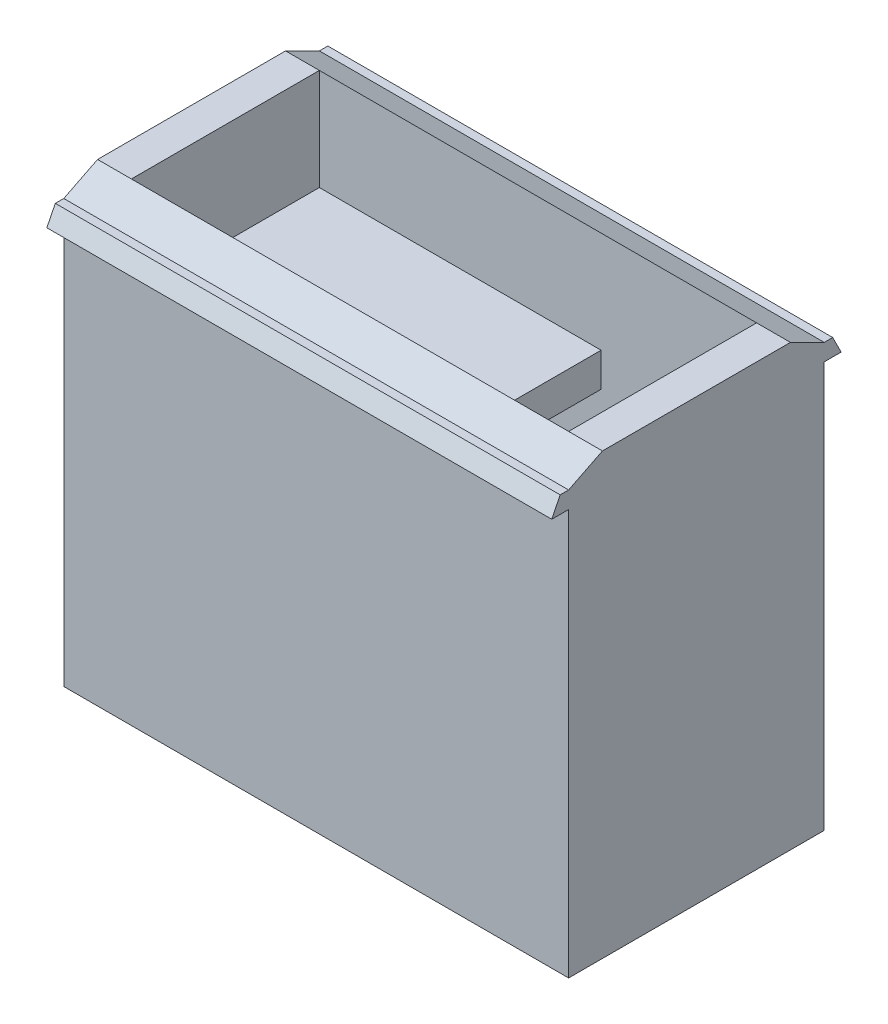
ISO-10303-21;
HEADER;
FILE_DESCRIPTION(('STEP AP214'),'2;1');
FILE_NAME('part.step','',(''),(''),'','','');
FILE_SCHEMA(('AUTOMOTIVE_DESIGN { 1 0 10303 214 1 1 1 1 }'));
ENDSEC;
DATA;
#1=APPLICATION_CONTEXT('core data for automotive mechanical design processes');
#2=APPLICATION_PROTOCOL_DEFINITION('international standard','automotive_design',2000,#1);
#3=PRODUCT_CONTEXT('',#1,'mechanical');
#4=PRODUCT('Part','Part','',(#3));
#5=PRODUCT_RELATED_PRODUCT_CATEGORY('part','',(#4));
#6=PRODUCT_DEFINITION_FORMATION('','',#4);
#7=PRODUCT_DEFINITION_CONTEXT('part definition',#1,'design');
#8=PRODUCT_DEFINITION('design','',#6,#7);
#9=PRODUCT_DEFINITION_SHAPE('','',#8);
#10=(LENGTH_UNIT() NAMED_UNIT(*) SI_UNIT(.MILLI.,.METRE.));
#11=(NAMED_UNIT(*) PLANE_ANGLE_UNIT() SI_UNIT($,.RADIAN.));
#12=(NAMED_UNIT(*) SI_UNIT($,.STERADIAN.) SOLID_ANGLE_UNIT());
#13=UNCERTAINTY_MEASURE_WITH_UNIT(LENGTH_MEASURE(1.E-05),#10,'distance_accuracy_value','');
#14=(GEOMETRIC_REPRESENTATION_CONTEXT(3) GLOBAL_UNCERTAINTY_ASSIGNED_CONTEXT((#13)) GLOBAL_UNIT_ASSIGNED_CONTEXT((#10,
#11,#12)) REPRESENTATION_CONTEXT('',''));
#15=CARTESIAN_POINT('',(0.,0.,0.));
#16=DIRECTION('',(0.,0.,1.));
#17=DIRECTION('',(1.,0.,0.));
#18=AXIS2_PLACEMENT_3D('',#15,#16,#17);
#19=CARTESIAN_POINT('',(1.,10.,0.));
#20=DIRECTION('',(1.,0.,0.));
#21=DIRECTION('',(0.,0.,-1.));
#22=AXIS2_PLACEMENT_3D('',#19,#20,#21);
#23=PLANE('',#22);
#24=DIRECTION('',(0.,0.447213595499959,-0.894427190999916));
#25=VECTOR('',#24,1.);
#26=CARTESIAN_POINT('',(1.,12.4,1.2));
#27=LINE('',#26,#25);
#28=CARTESIAN_POINT('',(1.,12.5,1.));
#29=VERTEX_POINT('',#28);
#30=CARTESIAN_POINT('',(1.,13.,0.));
#31=VERTEX_POINT('',#30);
#32=EDGE_CURVE('E369',#29,#31,#27,.T.);
#33=ORIENTED_EDGE('',*,*,#32,.F.);
#34=DIRECTION('',(0.,0.,1.));
#35=VECTOR('',#34,1.);
#36=CARTESIAN_POINT('',(1.,12.5,0.));
#37=LINE('',#36,#35);
#38=CARTESIAN_POINT('',(1.,12.5,1.25));
#39=VERTEX_POINT('',#38);
#40=EDGE_CURVE('E376',#29,#39,#37,.T.);
#41=ORIENTED_EDGE('',*,*,#40,.T.);
#42=DIRECTION('',(0.,0.894427190999916,-0.447213595499958));
#43=VECTOR('',#42,1.);
#44=CARTESIAN_POINT('',(1.,3.,6.));
#45=LINE('',#44,#43);
#46=CARTESIAN_POINT('',(1.,12.,1.5));
#47=VERTEX_POINT('',#46);
#48=EDGE_CURVE('E365',#47,#39,#45,.T.);
#49=ORIENTED_EDGE('',*,*,#48,.F.);
#50=DIRECTION('',(0.,0.,-1.));
#51=VECTOR('',#50,1.);
#52=CARTESIAN_POINT('',(1.,12.,2.));
#53=LINE('',#52,#51);
#54=CARTESIAN_POINT('',(1.,12.,1.));
#55=VERTEX_POINT('',#54);
#56=EDGE_CURVE('E337',#47,#55,#53,.T.);
#57=ORIENTED_EDGE('',*,*,#56,.T.);
#58=DIRECTION('',(0.,-1.,0.));
#59=VECTOR('',#58,1.);
#60=CARTESIAN_POINT('',(1.,10.,1.));
#61=LINE('',#60,#59);
#62=CARTESIAN_POINT('',(1.,0.,1.));
#63=VERTEX_POINT('',#62);
#64=EDGE_CURVE('E298',#55,#63,#61,.T.);
#65=ORIENTED_EDGE('',*,*,#64,.T.);
#66=DIRECTION('',(0.,0.,1.));
#67=VECTOR('',#66,1.);
#68=CARTESIAN_POINT('',(1.,0.,0.));
#69=LINE('',#68,#67);
#70=CARTESIAN_POINT('',(1.,0.,-6.56));
#71=VERTEX_POINT('',#70);
#72=EDGE_CURVE('E273',#71,#63,#69,.T.);
#73=ORIENTED_EDGE('',*,*,#72,.F.);
#74=DIRECTION('',(0.,-1.,0.));
#75=VECTOR('',#74,1.);
#76=CARTESIAN_POINT('',(1.,10.,-6.56));
#77=LINE('',#76,#75);
#78=CARTESIAN_POINT('',(1.,12.001317313685,-6.56));
#79=VERTEX_POINT('',#78);
#80=EDGE_CURVE('E306',#79,#71,#77,.T.);
#81=ORIENTED_EDGE('',*,*,#80,.F.);
#82=DIRECTION('',(0.,0.,1.));
#83=VECTOR('',#82,1.);
#84=CARTESIAN_POINT('',(1.,12.001317313685,-7.56));
#85=LINE('',#84,#83);
#86=CARTESIAN_POINT('',(1.,12.001317313685,-7.06));
#87=VERTEX_POINT('',#86);
#88=EDGE_CURVE('E333',#87,#79,#85,.T.);
#89=ORIENTED_EDGE('',*,*,#88,.F.);
#90=DIRECTION('',(0.,0.894191169765689,0.447685326890516));
#91=VECTOR('',#90,1.);
#92=CARTESIAN_POINT('',(1.,5.23156268074281,-10.4493421432594));
#93=LINE('',#92,#91);
#94=CARTESIAN_POINT('',(1.,12.5006586568425,-6.81));
#95=VERTEX_POINT('',#94);
#96=EDGE_CURVE('E366',#87,#95,#93,.T.);
#97=ORIENTED_EDGE('',*,*,#96,.T.);
#98=DIRECTION('',(0.,0.,-1.));
#99=VECTOR('',#98,1.);
#100=CARTESIAN_POINT('',(1.,12.5006586568425,0.));
#101=LINE('',#100,#99);
#102=CARTESIAN_POINT('',(1.,12.5006586568425,-6.56));
#103=VERTEX_POINT('',#102);
#104=EDGE_CURVE('E82',#103,#95,#101,.T.);
#105=ORIENTED_EDGE('',*,*,#104,.F.);
#106=DIRECTION('',(0.,-0.446742112774849,-0.894662777069362));
#107=VECTOR('',#106,1.);
#108=CARTESIAN_POINT('',(1.,14.6235049322447,-2.30870716296248));
#109=LINE('',#108,#107);
#110=CARTESIAN_POINT('',(1.,13.,-5.55999999999999));
#111=VERTEX_POINT('',#110);
#112=EDGE_CURVE('E374',#111,#103,#109,.T.);
#113=ORIENTED_EDGE('',*,*,#112,.F.);
#114=DIRECTION('',(0.,0.,-1.));
#115=VECTOR('',#114,1.);
#116=CARTESIAN_POINT('',(1.,13.,0.));
#117=LINE('',#116,#115);
#118=EDGE_CURVE('E221',#31,#111,#117,.T.);
#119=ORIENTED_EDGE('',*,*,#118,.F.);
#120=EDGE_LOOP('',(#33,#41,#49,#57,#65,#73,#81,#89,#97,#105,#113,#119));
#121=FACE_BOUND('',#120,.T.);
#122=ADVANCED_FACE('F60',(#121),#23,.T.);
#123=CARTESIAN_POINT('',(-13.9319558976376,10.,0.));
#124=DIRECTION('',(1.,0.,0.));
#125=DIRECTION('',(0.,0.,-1.));
#126=AXIS2_PLACEMENT_3D('',#123,#124,#125);
#127=PLANE('',#126);
#128=DIRECTION('',(0.,0.,-1.));
#129=VECTOR('',#128,1.);
#130=CARTESIAN_POINT('',(-13.9319558976376,12.5,0.));
#131=LINE('',#130,#129);
#132=CARTESIAN_POINT('',(-13.9319558976376,12.5,1.25));
#133=VERTEX_POINT('',#132);
#134=CARTESIAN_POINT('',(-13.9319558976376,12.5,1.));
#135=VERTEX_POINT('',#134);
#136=EDGE_CURVE('E74',#133,#135,#131,.T.);
#137=ORIENTED_EDGE('',*,*,#136,.T.);
#138=DIRECTION('',(0.,-0.447213595499959,0.894427190999916));
#139=VECTOR('',#138,1.);
#140=CARTESIAN_POINT('',(-13.9319558976376,10.4,5.20000000000001));
#141=LINE('',#140,#139);
#142=CARTESIAN_POINT('',(-13.9319558976376,13.,0.));
#143=VERTEX_POINT('',#142);
#144=EDGE_CURVE('E201',#143,#135,#141,.T.);
#145=ORIENTED_EDGE('',*,*,#144,.F.);
#146=DIRECTION('',(0.,0.,1.));
#147=VECTOR('',#146,1.);
#148=CARTESIAN_POINT('',(-13.9319558976376,13.,0.));
#149=LINE('',#148,#147);
#150=CARTESIAN_POINT('',(-13.9319558976376,13.,-5.55999999999999));
#151=VERTEX_POINT('',#150);
#152=EDGE_CURVE('E214',#151,#143,#149,.T.);
#153=ORIENTED_EDGE('',*,*,#152,.F.);
#154=DIRECTION('',(0.,0.446742112774849,0.894662777069363));
#155=VECTOR('',#154,1.);
#156=CARTESIAN_POINT('',(-13.9319558976376,12.6277197789794,-6.30554255545229));
#157=LINE('',#156,#155);
#158=CARTESIAN_POINT('',(-13.9319558976376,12.5006586568425,-6.56));
#159=VERTEX_POINT('',#158);
#160=EDGE_CURVE('E317',#159,#151,#157,.T.);
#161=ORIENTED_EDGE('',*,*,#160,.F.);
#162=DIRECTION('',(0.,0.,1.));
#163=VECTOR('',#162,1.);
#164=CARTESIAN_POINT('',(-13.9319558976376,12.5006586568425,-6.81));
#165=LINE('',#164,#163);
#166=CARTESIAN_POINT('',(-13.9319558976376,12.5006586568425,-6.81));
#167=VERTEX_POINT('',#166);
#168=EDGE_CURVE('E216',#167,#159,#165,.T.);
#169=ORIENTED_EDGE('',*,*,#168,.F.);
#170=DIRECTION('',(0.,0.894191169765689,0.447685326890516));
#171=VECTOR('',#170,1.);
#172=CARTESIAN_POINT('',(-13.9319558976376,13.2273411616121,-6.44617948186777));
#173=LINE('',#172,#171);
#174=CARTESIAN_POINT('',(-13.9319558976376,12.001317313685,-7.06));
#175=VERTEX_POINT('',#174);
#176=EDGE_CURVE('E315',#175,#167,#173,.T.);
#177=ORIENTED_EDGE('',*,*,#176,.F.);
#178=DIRECTION('',(0.,0.,1.));
#179=VECTOR('',#178,1.);
#180=CARTESIAN_POINT('',(-13.9319558976376,12.001317313685,-7.56));
#181=LINE('',#180,#179);
#182=CARTESIAN_POINT('',(-13.9319558976376,12.001317313685,-6.56));
#183=VERTEX_POINT('',#182);
#184=EDGE_CURVE('E326',#175,#183,#181,.T.);
#185=ORIENTED_EDGE('',*,*,#184,.T.);
#186=DIRECTION('',(0.,-1.,0.));
#187=VECTOR('',#186,1.);
#188=CARTESIAN_POINT('',(-13.9319558976376,10.,-6.56));
#189=LINE('',#188,#187);
#190=CARTESIAN_POINT('',(-13.9319558976376,0.,-6.56));
#191=VERTEX_POINT('',#190);
#192=EDGE_CURVE('E304',#183,#191,#189,.T.);
#193=ORIENTED_EDGE('',*,*,#192,.T.);
#194=DIRECTION('',(0.,0.,1.));
#195=VECTOR('',#194,1.);
#196=CARTESIAN_POINT('',(-13.9319558976376,0.,0.));
#197=LINE('',#196,#195);
#198=CARTESIAN_POINT('',(-13.9319558976376,0.,1.));
#199=VERTEX_POINT('',#198);
#200=EDGE_CURVE('E279',#191,#199,#197,.T.);
#201=ORIENTED_EDGE('',*,*,#200,.T.);
#202=DIRECTION('',(0.,-1.,0.));
#203=VECTOR('',#202,1.);
#204=CARTESIAN_POINT('',(-13.9319558976376,10.,1.));
#205=LINE('',#204,#203);
#206=CARTESIAN_POINT('',(-13.9319558976376,12.,1.));
#207=VERTEX_POINT('',#206);
#208=EDGE_CURVE('E294',#207,#199,#205,.T.);
#209=ORIENTED_EDGE('',*,*,#208,.F.);
#210=DIRECTION('',(0.,0.,-1.));
#211=VECTOR('',#210,1.);
#212=CARTESIAN_POINT('',(-13.9319558976376,12.,2.));
#213=LINE('',#212,#211);
#214=CARTESIAN_POINT('',(-13.9319558976376,12.,1.5));
#215=VERTEX_POINT('',#214);
#216=EDGE_CURVE('E227',#215,#207,#213,.T.);
#217=ORIENTED_EDGE('',*,*,#216,.F.);
#218=DIRECTION('',(0.,0.894427190999916,-0.447213595499958));
#219=VECTOR('',#218,1.);
#220=CARTESIAN_POINT('',(-13.9319558976376,11.,2.));
#221=LINE('',#220,#219);
#222=EDGE_CURVE('E323',#215,#133,#221,.T.);
#223=ORIENTED_EDGE('',*,*,#222,.T.);
#224=EDGE_LOOP('',(#137,#145,#153,#161,#169,#177,#185,#193,#201,#209,#217,#223));
#225=FACE_BOUND('',#224,.T.);
#226=ADVANCED_FACE('F212',(#225),#127,.F.);
#227=CARTESIAN_POINT('',(0.,13.,0.));
#228=DIRECTION('',(0.,1.,0.));
#229=DIRECTION('',(0.,0.,1.));
#230=AXIS2_PLACEMENT_3D('',#227,#228,#229);
#231=PLANE('',#230);
#232=DIRECTION('',(-1.,0.,0.));
#233=VECTOR('',#232,1.);
#234=CARTESIAN_POINT('',(1.06804410236237,13.,0.));
#235=LINE('',#234,#233);
#236=CARTESIAN_POINT('',(0.,13.,0.));
#237=VERTEX_POINT('',#236);
#238=EDGE_CURVE('E208',#31,#237,#235,.T.);
#239=ORIENTED_EDGE('',*,*,#238,.F.);
#240=ORIENTED_EDGE('',*,*,#118,.T.);
#241=DIRECTION('',(-1.,0.,0.));
#242=VECTOR('',#241,1.);
#243=CARTESIAN_POINT('',(1.06804410236237,13.,-5.55999999999999));
#244=LINE('',#243,#242);
#245=CARTESIAN_POINT('',(0.,13.,-5.55999999999999));
#246=VERTEX_POINT('',#245);
#247=EDGE_CURVE('E384',#111,#246,#244,.T.);
#248=ORIENTED_EDGE('',*,*,#247,.T.);
#249=DIRECTION('',(0.,0.,1.));
#250=VECTOR('',#249,1.);
#251=CARTESIAN_POINT('',(0.,13.,0.));
#252=LINE('',#251,#250);
#253=EDGE_CURVE('E234',#246,#237,#252,.T.);
#254=ORIENTED_EDGE('',*,*,#253,.T.);
#255=EDGE_LOOP('',(#239,#240,#248,#254));
#256=FACE_BOUND('',#255,.T.);
#257=ADVANCED_FACE('F399',(#256),#231,.T.);
#258=CARTESIAN_POINT('',(-14.,3.,6.));
#259=DIRECTION('',(0.,-0.447213595499958,-0.894427190999916));
#260=DIRECTION('',(0.,0.894427190999916,-0.447213595499958));
#261=AXIS2_PLACEMENT_3D('',#258,#259,#260);
#262=PLANE('',#261);
#263=DIRECTION('',(1.,0.,0.));
#264=VECTOR('',#263,1.);
#265=CARTESIAN_POINT('',(-14.,12.5,1.25));
#266=LINE('',#265,#264);
#267=EDGE_CURVE('E12',#133,#39,#266,.T.);
#268=ORIENTED_EDGE('',*,*,#267,.F.);
#269=ORIENTED_EDGE('',*,*,#222,.F.);
#270=DIRECTION('',(1.,0.,0.));
#271=VECTOR('',#270,1.);
#272=CARTESIAN_POINT('',(-14.,12.,1.5));
#273=LINE('',#272,#271);
#274=EDGE_CURVE('E328',#215,#47,#273,.T.);
#275=ORIENTED_EDGE('',*,*,#274,.T.);
#276=ORIENTED_EDGE('',*,*,#48,.T.);
#277=EDGE_LOOP('',(#268,#269,#275,#276));
#278=FACE_BOUND('',#277,.T.);
#279=ADVANCED_FACE('F467',(#278),#262,.F.);
#280=CARTESIAN_POINT('',(1.,12.001317313685,-7.56));
#281=DIRECTION('',(0.,1.,0.));
#282=DIRECTION('',(0.,0.,1.));
#283=AXIS2_PLACEMENT_3D('',#280,#281,#282);
#284=PLANE('',#283);
#285=DIRECTION('',(1.,0.,0.));
#286=VECTOR('',#285,1.);
#287=CARTESIAN_POINT('',(-14.,12.001317313685,-7.06));
#288=LINE('',#287,#286);
#289=EDGE_CURVE('E321',#175,#87,#288,.T.);
#290=ORIENTED_EDGE('',*,*,#289,.T.);
#291=ORIENTED_EDGE('',*,*,#88,.T.);
#292=DIRECTION('',(-1.,0.,0.));
#293=VECTOR('',#292,1.);
#294=CARTESIAN_POINT('',(1.,12.001317313685,-6.56));
#295=LINE('',#294,#293);
#296=EDGE_CURVE('E322',#79,#183,#295,.T.);
#297=ORIENTED_EDGE('',*,*,#296,.T.);
#298=ORIENTED_EDGE('',*,*,#184,.F.);
#299=EDGE_LOOP('',(#290,#291,#297,#298));
#300=FACE_BOUND('',#299,.T.);
#301=ADVANCED_FACE('F364',(#300),#284,.F.);
#302=CARTESIAN_POINT('',(-12.9319558976376,13.,0.));
#303=VERTEX_POINT('',#302);
#304=EDGE_CURVE('E197',#303,#143,#235,.T.);
#305=ORIENTED_EDGE('',*,*,#304,.F.);
#306=DIRECTION('',(0.,0.,1.));
#307=VECTOR('',#306,1.);
#308=CARTESIAN_POINT('',(-12.9319558976376,13.,0.));
#309=LINE('',#308,#307);
#310=CARTESIAN_POINT('',(-12.9319558976376,13.,-5.55999999999999));
#311=VERTEX_POINT('',#310);
#312=EDGE_CURVE('E238',#311,#303,#309,.T.);
#313=ORIENTED_EDGE('',*,*,#312,.F.);
#314=EDGE_CURVE('E220',#311,#151,#244,.T.);
#315=ORIENTED_EDGE('',*,*,#314,.T.);
#316=ORIENTED_EDGE('',*,*,#152,.T.);
#317=EDGE_LOOP('',(#305,#313,#315,#316));
#318=FACE_BOUND('',#317,.T.);
#319=ADVANCED_FACE('F219',(#318),#231,.T.);
#320=CARTESIAN_POINT('',(0.,10.,-6.56));
#321=DIRECTION('',(0.,0.,1.));
#322=DIRECTION('',(1.,0.,0.));
#323=AXIS2_PLACEMENT_3D('',#320,#321,#322);
#324=PLANE('',#323);
#325=ORIENTED_EDGE('',*,*,#296,.F.);
#326=ORIENTED_EDGE('',*,*,#80,.T.);
#327=DIRECTION('',(-1.,0.,0.));
#328=VECTOR('',#327,1.);
#329=CARTESIAN_POINT('',(0.,0.,-6.56));
#330=LINE('',#329,#328);
#331=EDGE_CURVE('E276',#71,#191,#330,.T.);
#332=ORIENTED_EDGE('',*,*,#331,.T.);
#333=ORIENTED_EDGE('',*,*,#192,.F.);
#334=EDGE_LOOP('',(#325,#326,#332,#333));
#335=FACE_BOUND('',#334,.T.);
#336=ADVANCED_FACE('F362',(#335),#324,.F.);
#337=CARTESIAN_POINT('',(0.,10.,1.));
#338=DIRECTION('',(0.,0.,-1.));
#339=DIRECTION('',(-1.,0.,0.));
#340=AXIS2_PLACEMENT_3D('',#337,#338,#339);
#341=PLANE('',#340);
#342=DIRECTION('',(1.,0.,0.));
#343=VECTOR('',#342,1.);
#344=CARTESIAN_POINT('',(-13.9319558976376,12.,1.));
#345=LINE('',#344,#343);
#346=EDGE_CURVE('E335',#207,#55,#345,.T.);
#347=ORIENTED_EDGE('',*,*,#346,.F.);
#348=ORIENTED_EDGE('',*,*,#208,.T.);
#349=DIRECTION('',(1.,0.,0.));
#350=VECTOR('',#349,1.);
#351=CARTESIAN_POINT('',(0.,0.,1.));
#352=LINE('',#351,#350);
#353=EDGE_CURVE('E270',#199,#63,#352,.T.);
#354=ORIENTED_EDGE('',*,*,#353,.T.);
#355=ORIENTED_EDGE('',*,*,#64,.F.);
#356=EDGE_LOOP('',(#347,#348,#354,#355));
#357=FACE_BOUND('',#356,.T.);
#358=ADVANCED_FACE('F62',(#357),#341,.F.);
#359=CARTESIAN_POINT('',(0.,10.,0.));
#360=DIRECTION('',(0.,1.,0.));
#361=DIRECTION('',(0.,0.,1.));
#362=AXIS2_PLACEMENT_3D('',#359,#360,#361);
#363=PLANE('',#362);
#364=DIRECTION('',(0.,0.,1.));
#365=VECTOR('',#364,1.);
#366=CARTESIAN_POINT('',(-4.59948346161411,10.,0.));
#367=LINE('',#366,#365);
#368=CARTESIAN_POINT('',(-4.59948346161411,10.,-5.56));
#369=VERTEX_POINT('',#368);
#370=CARTESIAN_POINT('',(-4.59948346161411,10.,0.));
#371=VERTEX_POINT('',#370);
#372=EDGE_CURVE('E253',#369,#371,#367,.T.);
#373=ORIENTED_EDGE('',*,*,#372,.F.);
#374=DIRECTION('',(-1.,0.,0.));
#375=VECTOR('',#374,1.);
#376=CARTESIAN_POINT('',(0.,10.,-5.56));
#377=LINE('',#376,#375);
#378=CARTESIAN_POINT('',(-12.9319558976376,10.,-5.56));
#379=VERTEX_POINT('',#378);
#380=EDGE_CURVE('E242',#369,#379,#377,.T.);
#381=ORIENTED_EDGE('',*,*,#380,.T.);
#382=DIRECTION('',(0.,0.,1.));
#383=VECTOR('',#382,1.);
#384=CARTESIAN_POINT('',(-12.9319558976376,10.,0.));
#385=LINE('',#384,#383);
#386=CARTESIAN_POINT('',(-12.9319558976376,10.,0.));
#387=VERTEX_POINT('',#386);
#388=EDGE_CURVE('E222',#379,#387,#385,.T.);
#389=ORIENTED_EDGE('',*,*,#388,.T.);
#390=DIRECTION('',(-1.,0.,0.));
#391=VECTOR('',#390,1.);
#392=CARTESIAN_POINT('',(0.,10.,0.));
#393=LINE('',#392,#391);
#394=EDGE_CURVE('E244',#371,#387,#393,.T.);
#395=ORIENTED_EDGE('',*,*,#394,.F.);
#396=EDGE_LOOP('',(#373,#381,#389,#395));
#397=FACE_BOUND('',#396,.T.);
#398=ADVANCED_FACE('F426',(#397),#363,.T.);
#399=CARTESIAN_POINT('',(0.,10.,0.));
#400=DIRECTION('',(0.,0.,-1.));
#401=DIRECTION('',(-1.,0.,0.));
#402=AXIS2_PLACEMENT_3D('',#399,#400,#401);
#403=PLANE('',#402);
#404=DIRECTION('',(1.,0.,0.));
#405=VECTOR('',#404,1.);
#406=CARTESIAN_POINT('',(0.,9.,0.));
#407=LINE('',#406,#405);
#408=CARTESIAN_POINT('',(-13.,9.,0.));
#409=VERTEX_POINT('',#408);
#410=CARTESIAN_POINT('',(-4.59948346161411,9.,0.));
#411=VERTEX_POINT('',#410);
#412=EDGE_CURVE('E268',#409,#411,#407,.T.);
#413=ORIENTED_EDGE('',*,*,#412,.T.);
#414=DIRECTION('',(0.,1.,0.));
#415=VECTOR('',#414,1.);
#416=CARTESIAN_POINT('',(-4.59948346161411,10.,0.));
#417=LINE('',#416,#415);
#418=EDGE_CURVE('E261',#411,#371,#417,.T.);
#419=ORIENTED_EDGE('',*,*,#418,.T.);
#420=ORIENTED_EDGE('',*,*,#394,.T.);
#421=DIRECTION('',(0.,-1.,0.));
#422=VECTOR('',#421,1.);
#423=CARTESIAN_POINT('',(-12.9319558976376,13.,0.));
#424=LINE('',#423,#422);
#425=EDGE_CURVE('E250',#303,#387,#424,.T.);
#426=ORIENTED_EDGE('',*,*,#425,.F.);
#427=DIRECTION('',(-1.,0.,0.));
#428=VECTOR('',#427,1.);
#429=CARTESIAN_POINT('',(0.,13.,0.));
#430=LINE('',#429,#428);
#431=EDGE_CURVE('E203',#237,#303,#430,.T.);
#432=ORIENTED_EDGE('',*,*,#431,.F.);
#433=DIRECTION('',(0.,-1.,0.));
#434=VECTOR('',#433,1.);
#435=CARTESIAN_POINT('',(0.,10.,0.));
#436=LINE('',#435,#434);
#437=CARTESIAN_POINT('',(0.,0.,0.));
#438=VERTEX_POINT('',#437);
#439=EDGE_CURVE('E295',#237,#438,#436,.T.);
#440=ORIENTED_EDGE('',*,*,#439,.T.);
#441=DIRECTION('',(1.,0.,0.));
#442=VECTOR('',#441,1.);
#443=CARTESIAN_POINT('',(0.,0.,0.));
#444=LINE('',#443,#442);
#445=CARTESIAN_POINT('',(-13.,0.,0.));
#446=VERTEX_POINT('',#445);
#447=EDGE_CURVE('E282',#446,#438,#444,.T.);
#448=ORIENTED_EDGE('',*,*,#447,.F.);
#449=DIRECTION('',(0.,-1.,0.));
#450=VECTOR('',#449,1.);
#451=CARTESIAN_POINT('',(-13.,10.,0.));
#452=LINE('',#451,#450);
#453=EDGE_CURVE('E246',#409,#446,#452,.T.);
#454=ORIENTED_EDGE('',*,*,#453,.F.);
#455=EDGE_LOOP('',(#413,#419,#420,#426,#432,#440,#448,#454));
#456=FACE_BOUND('',#455,.T.);
#457=ADVANCED_FACE('F397',(#456),#403,.T.);
#458=CARTESIAN_POINT('',(-13.,10.,0.));
#459=DIRECTION('',(1.,0.,0.));
#460=DIRECTION('',(0.,0.,-1.));
#461=AXIS2_PLACEMENT_3D('',#458,#459,#460);
#462=PLANE('',#461);
#463=DIRECTION('',(0.,-1.,0.));
#464=VECTOR('',#463,1.);
#465=CARTESIAN_POINT('',(-13.,10.,-5.56));
#466=LINE('',#465,#464);
#467=CARTESIAN_POINT('',(-13.,9.,-5.56));
#468=VERTEX_POINT('',#467);
#469=CARTESIAN_POINT('',(-13.,0.,-5.56));
#470=VERTEX_POINT('',#469);
#471=EDGE_CURVE('E300',#468,#470,#466,.T.);
#472=ORIENTED_EDGE('',*,*,#471,.F.);
#473=DIRECTION('',(0.,0.,1.));
#474=VECTOR('',#473,1.);
#475=CARTESIAN_POINT('',(-13.,9.,0.));
#476=LINE('',#475,#474);
#477=EDGE_CURVE('E266',#468,#409,#476,.T.);
#478=ORIENTED_EDGE('',*,*,#477,.T.);
#479=ORIENTED_EDGE('',*,*,#453,.T.);
#480=DIRECTION('',(0.,0.,1.));
#481=VECTOR('',#480,1.);
#482=CARTESIAN_POINT('',(-13.,0.,0.));
#483=LINE('',#482,#481);
#484=EDGE_CURVE('E285',#470,#446,#483,.T.);
#485=ORIENTED_EDGE('',*,*,#484,.F.);
#486=EDGE_LOOP('',(#472,#478,#479,#485));
#487=FACE_BOUND('',#486,.T.);
#488=ADVANCED_FACE('F433',(#487),#462,.T.);
#489=CARTESIAN_POINT('',(0.,10.,-5.56));
#490=DIRECTION('',(0.,0.,1.));
#491=DIRECTION('',(1.,0.,0.));
#492=AXIS2_PLACEMENT_3D('',#489,#490,#491);
#493=PLANE('',#492);
#494=DIRECTION('',(0.,-1.,0.));
#495=VECTOR('',#494,1.);
#496=CARTESIAN_POINT('',(0.,10.,-5.56));
#497=LINE('',#496,#495);
#498=CARTESIAN_POINT('',(0.,0.,-5.56));
#499=VERTEX_POINT('',#498);
#500=EDGE_CURVE('E297',#246,#499,#497,.T.);
#501=ORIENTED_EDGE('',*,*,#500,.F.);
#502=DIRECTION('',(-1.,0.,0.));
#503=VECTOR('',#502,1.);
#504=CARTESIAN_POINT('',(0.,13.,-5.56));
#505=LINE('',#504,#503);
#506=EDGE_CURVE('E225',#246,#311,#505,.T.);
#507=ORIENTED_EDGE('',*,*,#506,.T.);
#508=DIRECTION('',(0.,-1.,0.));
#509=VECTOR('',#508,1.);
#510=CARTESIAN_POINT('',(-12.9319558976376,13.,-5.56));
#511=LINE('',#510,#509);
#512=EDGE_CURVE('E241',#311,#379,#511,.T.);
#513=ORIENTED_EDGE('',*,*,#512,.T.);
#514=ORIENTED_EDGE('',*,*,#380,.F.);
#515=DIRECTION('',(0.,-1.,0.));
#516=VECTOR('',#515,1.);
#517=CARTESIAN_POINT('',(-4.59948346161411,10.,-5.56));
#518=LINE('',#517,#516);
#519=CARTESIAN_POINT('',(-4.59948346161411,9.,-5.56));
#520=VERTEX_POINT('',#519);
#521=EDGE_CURVE('E257',#369,#520,#518,.T.);
#522=ORIENTED_EDGE('',*,*,#521,.T.);
#523=DIRECTION('',(-1.,0.,0.));
#524=VECTOR('',#523,1.);
#525=CARTESIAN_POINT('',(0.,9.,-5.56));
#526=LINE('',#525,#524);
#527=EDGE_CURVE('E264',#520,#468,#526,.T.);
#528=ORIENTED_EDGE('',*,*,#527,.T.);
#529=ORIENTED_EDGE('',*,*,#471,.T.);
#530=DIRECTION('',(-1.,0.,0.));
#531=VECTOR('',#530,1.);
#532=CARTESIAN_POINT('',(0.,0.,-5.56));
#533=LINE('',#532,#531);
#534=EDGE_CURVE('E288',#499,#470,#533,.T.);
#535=ORIENTED_EDGE('',*,*,#534,.F.);
#536=EDGE_LOOP('',(#501,#507,#513,#514,#522,#528,#529,#535));
#537=FACE_BOUND('',#536,.T.);
#538=ADVANCED_FACE('F405',(#537),#493,.T.);
#539=CARTESIAN_POINT('',(0.,10.,0.));
#540=DIRECTION('',(-1.,0.,0.));
#541=DIRECTION('',(0.,0.,1.));
#542=AXIS2_PLACEMENT_3D('',#539,#540,#541);
#543=PLANE('',#542);
#544=DIRECTION('',(0.,0.,-1.));
#545=VECTOR('',#544,1.);
#546=CARTESIAN_POINT('',(0.,0.,0.));
#547=LINE('',#546,#545);
#548=EDGE_CURVE('E291',#438,#499,#547,.T.);
#549=ORIENTED_EDGE('',*,*,#548,.F.);
#550=ORIENTED_EDGE('',*,*,#439,.F.);
#551=ORIENTED_EDGE('',*,*,#253,.F.);
#552=ORIENTED_EDGE('',*,*,#500,.T.);
#553=EDGE_LOOP('',(#549,#550,#551,#552));
#554=FACE_BOUND('',#553,.T.);
#555=ADVANCED_FACE('F394',(#554),#543,.T.);
#556=CARTESIAN_POINT('',(0.,0.,0.));
#557=DIRECTION('',(0.,1.,0.));
#558=DIRECTION('',(0.,0.,1.));
#559=AXIS2_PLACEMENT_3D('',#556,#557,#558);
#560=PLANE('',#559);
#561=ORIENTED_EDGE('',*,*,#353,.F.);
#562=ORIENTED_EDGE('',*,*,#200,.F.);
#563=ORIENTED_EDGE('',*,*,#331,.F.);
#564=ORIENTED_EDGE('',*,*,#72,.T.);
#565=EDGE_LOOP('',(#561,#562,#563,#564));
#566=FACE_BOUND('',#565,.T.);
#567=ORIENTED_EDGE('',*,*,#447,.T.);
#568=ORIENTED_EDGE('',*,*,#548,.T.);
#569=ORIENTED_EDGE('',*,*,#534,.T.);
#570=ORIENTED_EDGE('',*,*,#484,.T.);
#571=EDGE_LOOP('',(#567,#568,#569,#570));
#572=FACE_BOUND('',#571,.T.);
#573=ADVANCED_FACE('F354',(#566,#572),#560,.F.);
#574=CARTESIAN_POINT('',(-4.59948346161411,9.,0.));
#575=DIRECTION('',(-1.,0.,0.));
#576=DIRECTION('',(0.,0.,1.));
#577=AXIS2_PLACEMENT_3D('',#574,#575,#576);
#578=PLANE('',#577);
#579=ORIENTED_EDGE('',*,*,#418,.F.);
#580=DIRECTION('',(0.,0.,1.));
#581=VECTOR('',#580,1.);
#582=CARTESIAN_POINT('',(-4.59948346161411,9.,0.));
#583=LINE('',#582,#581);
#584=EDGE_CURVE('E254',#520,#411,#583,.T.);
#585=ORIENTED_EDGE('',*,*,#584,.F.);
#586=ORIENTED_EDGE('',*,*,#521,.F.);
#587=ORIENTED_EDGE('',*,*,#372,.T.);
#588=EDGE_LOOP('',(#579,#585,#586,#587));
#589=FACE_BOUND('',#588,.T.);
#590=ADVANCED_FACE('F418',(#589),#578,.F.);
#591=CARTESIAN_POINT('',(0.,9.,0.));
#592=DIRECTION('',(0.,1.,0.));
#593=DIRECTION('',(0.,0.,1.));
#594=AXIS2_PLACEMENT_3D('',#591,#592,#593);
#595=PLANE('',#594);
#596=ORIENTED_EDGE('',*,*,#412,.F.);
#597=ORIENTED_EDGE('',*,*,#477,.F.);
#598=ORIENTED_EDGE('',*,*,#527,.F.);
#599=ORIENTED_EDGE('',*,*,#584,.T.);
#600=EDGE_LOOP('',(#596,#597,#598,#599));
#601=FACE_BOUND('',#600,.T.);
#602=ADVANCED_FACE('F414',(#601),#595,.F.);
#603=CARTESIAN_POINT('',(-12.9319558976376,13.,0.));
#604=DIRECTION('',(1.,0.,0.));
#605=DIRECTION('',(0.,0.,-1.));
#606=AXIS2_PLACEMENT_3D('',#603,#604,#605);
#607=PLANE('',#606);
#608=ORIENTED_EDGE('',*,*,#388,.F.);
#609=ORIENTED_EDGE('',*,*,#512,.F.);
#610=ORIENTED_EDGE('',*,*,#312,.T.);
#611=ORIENTED_EDGE('',*,*,#425,.T.);
#612=EDGE_LOOP('',(#608,#609,#610,#611));
#613=FACE_BOUND('',#612,.T.);
#614=ADVANCED_FACE('F423',(#613),#607,.T.);
#615=CARTESIAN_POINT('',(-13.9319558976376,12.,2.));
#616=DIRECTION('',(0.,1.,0.));
#617=DIRECTION('',(0.,0.,1.));
#618=AXIS2_PLACEMENT_3D('',#615,#616,#617);
#619=PLANE('',#618);
#620=ORIENTED_EDGE('',*,*,#56,.F.);
#621=ORIENTED_EDGE('',*,*,#274,.F.);
#622=ORIENTED_EDGE('',*,*,#216,.T.);
#623=ORIENTED_EDGE('',*,*,#346,.T.);
#624=EDGE_LOOP('',(#620,#621,#622,#623));
#625=FACE_BOUND('',#624,.T.);
#626=ADVANCED_FACE('F346',(#625),#619,.F.);
#627=CARTESIAN_POINT('',(-14.,5.23156268074281,-10.4493421432594));
#628=DIRECTION('',(0.,0.447685326890516,-0.894191169765689));
#629=DIRECTION('',(0.,0.894191169765689,0.447685326890516));
#630=AXIS2_PLACEMENT_3D('',#627,#628,#629);
#631=PLANE('',#630);
#632=DIRECTION('',(-1.,0.,0.));
#633=VECTOR('',#632,1.);
#634=CARTESIAN_POINT('',(-14.,12.5006586568425,-6.81));
#635=LINE('',#634,#633);
#636=EDGE_CURVE('E68',#95,#167,#635,.T.);
#637=ORIENTED_EDGE('',*,*,#636,.F.);
#638=ORIENTED_EDGE('',*,*,#96,.F.);
#639=ORIENTED_EDGE('',*,*,#289,.F.);
#640=ORIENTED_EDGE('',*,*,#176,.T.);
#641=EDGE_LOOP('',(#637,#638,#639,#640));
#642=FACE_BOUND('',#641,.T.);
#643=ADVANCED_FACE('F319',(#642),#631,.T.);
#644=CARTESIAN_POINT('',(1.06804410236237,12.6277197789794,-6.30554255545229));
#645=DIRECTION('',(0.,-0.894662777069362,0.446742112774849));
#646=DIRECTION('',(0.,-0.446742112774849,-0.894662777069362));
#647=AXIS2_PLACEMENT_3D('',#644,#645,#646);
#648=PLANE('',#647);
#649=ORIENTED_EDGE('',*,*,#112,.T.);
#650=DIRECTION('',(-1.,0.,0.));
#651=VECTOR('',#650,1.);
#652=CARTESIAN_POINT('',(1.06804410236237,12.5006586568425,-6.56));
#653=LINE('',#652,#651);
#654=EDGE_CURVE('E382',#103,#159,#653,.T.);
#655=ORIENTED_EDGE('',*,*,#654,.T.);
#656=ORIENTED_EDGE('',*,*,#160,.T.);
#657=ORIENTED_EDGE('',*,*,#314,.F.);
#658=ORIENTED_EDGE('',*,*,#506,.F.);
#659=ORIENTED_EDGE('',*,*,#247,.F.);
#660=EDGE_LOOP('',(#649,#655,#656,#657,#658,#659));
#661=FACE_BOUND('',#660,.T.);
#662=ADVANCED_FACE('F470',(#661),#648,.F.);
#663=CARTESIAN_POINT('',(1.06804410236237,12.5006586568425,-6.81));
#664=DIRECTION('',(0.,-1.,0.));
#665=DIRECTION('',(0.,0.,-1.));
#666=AXIS2_PLACEMENT_3D('',#663,#664,#665);
#667=PLANE('',#666);
#668=ORIENTED_EDGE('',*,*,#104,.T.);
#669=ORIENTED_EDGE('',*,*,#636,.T.);
#670=ORIENTED_EDGE('',*,*,#168,.T.);
#671=ORIENTED_EDGE('',*,*,#654,.F.);
#672=EDGE_LOOP('',(#668,#669,#670,#671));
#673=FACE_BOUND('',#672,.T.);
#674=ADVANCED_FACE('F310',(#673),#667,.F.);
#675=CARTESIAN_POINT('',(1.06804410236237,12.5,0.));
#676=DIRECTION('',(0.,1.,0.));
#677=DIRECTION('',(0.,0.,1.));
#678=AXIS2_PLACEMENT_3D('',#675,#676,#677);
#679=PLANE('',#678);
#680=DIRECTION('',(-1.,0.,0.));
#681=VECTOR('',#680,1.);
#682=CARTESIAN_POINT('',(1.06804410236237,12.5,1.));
#683=LINE('',#682,#681);
#684=EDGE_CURVE('E380',#29,#135,#683,.T.);
#685=ORIENTED_EDGE('',*,*,#684,.T.);
#686=ORIENTED_EDGE('',*,*,#136,.F.);
#687=ORIENTED_EDGE('',*,*,#267,.T.);
#688=ORIENTED_EDGE('',*,*,#40,.F.);
#689=EDGE_LOOP('',(#685,#686,#687,#688));
#690=FACE_BOUND('',#689,.T.);
#691=ADVANCED_FACE('F478',(#690),#679,.T.);
#692=CARTESIAN_POINT('',(1.06804410236237,10.4,5.20000000000001));
#693=DIRECTION('',(0.,-0.894427190999916,-0.447213595499959));
#694=DIRECTION('',(0.,0.447213595499959,-0.894427190999916));
#695=AXIS2_PLACEMENT_3D('',#692,#693,#694);
#696=PLANE('',#695);
#697=ORIENTED_EDGE('',*,*,#32,.T.);
#698=ORIENTED_EDGE('',*,*,#238,.T.);
#699=ORIENTED_EDGE('',*,*,#431,.T.);
#700=ORIENTED_EDGE('',*,*,#304,.T.);
#701=ORIENTED_EDGE('',*,*,#144,.T.);
#702=ORIENTED_EDGE('',*,*,#684,.F.);
#703=EDGE_LOOP('',(#697,#698,#699,#700,#701,#702));
#704=FACE_BOUND('',#703,.T.);
#705=ADVANCED_FACE('F199',(#704),#696,.F.);
#706=CLOSED_SHELL('',(#122,#226,#257,#279,#301,#319,#336,#358,#398,#457,#488,#538,#555,#573,
#590,#602,#614,#626,#643,#662,#674,#691,#705));
#707=MANIFOLD_SOLID_BREP('B2',#706);
#708=ADVANCED_BREP_SHAPE_REPRESENTATION('',(#18,#707),#14);
#709=SHAPE_DEFINITION_REPRESENTATION(#9,#708);
ENDSEC;
END-ISO-10303-21;
